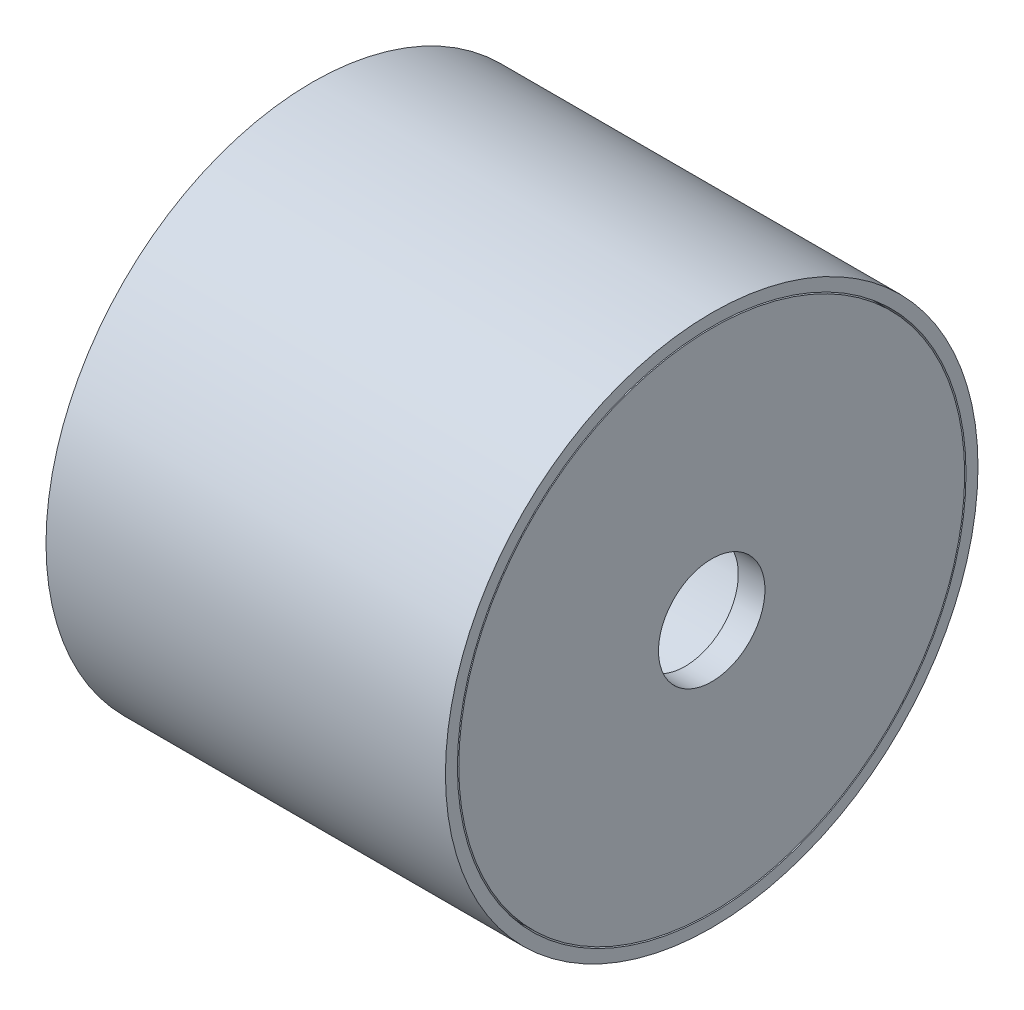
ISO-10303-21;
HEADER;
FILE_DESCRIPTION(('STEP AP214'),'2;1');
FILE_NAME('part.step','',(''),(''),'','','');
FILE_SCHEMA(('AUTOMOTIVE_DESIGN { 1 0 10303 214 1 1 1 1 }'));
ENDSEC;
DATA;
#1=APPLICATION_CONTEXT('core data for automotive mechanical design processes');
#2=APPLICATION_PROTOCOL_DEFINITION('international standard','automotive_design',2000,#1);
#3=PRODUCT_CONTEXT('',#1,'mechanical');
#4=PRODUCT('Part','Part','',(#3));
#5=PRODUCT_RELATED_PRODUCT_CATEGORY('part','',(#4));
#6=PRODUCT_DEFINITION_FORMATION('','',#4);
#7=PRODUCT_DEFINITION_CONTEXT('part definition',#1,'design');
#8=PRODUCT_DEFINITION('design','',#6,#7);
#9=PRODUCT_DEFINITION_SHAPE('','',#8);
#10=(LENGTH_UNIT() NAMED_UNIT(*) SI_UNIT(.MILLI.,.METRE.));
#11=(NAMED_UNIT(*) PLANE_ANGLE_UNIT() SI_UNIT($,.RADIAN.));
#12=(NAMED_UNIT(*) SI_UNIT($,.STERADIAN.) SOLID_ANGLE_UNIT());
#13=UNCERTAINTY_MEASURE_WITH_UNIT(LENGTH_MEASURE(1.E-05),#10,'distance_accuracy_value','');
#14=(GEOMETRIC_REPRESENTATION_CONTEXT(3) GLOBAL_UNCERTAINTY_ASSIGNED_CONTEXT((#13)) GLOBAL_UNIT_ASSIGNED_CONTEXT((#10,
#11,#12)) REPRESENTATION_CONTEXT('',''));
#15=CARTESIAN_POINT('',(0.,0.,0.));
#16=DIRECTION('',(0.,0.,1.));
#17=DIRECTION('',(1.,0.,0.));
#18=AXIS2_PLACEMENT_3D('',#15,#16,#17);
#19=CARTESIAN_POINT('',(15.,0.,0.));
#20=DIRECTION('',(1.,0.,0.));
#21=DIRECTION('',(0.,0.,1.));
#22=AXIS2_PLACEMENT_3D('',#19,#20,#21);
#23=CYLINDRICAL_SURFACE('',#22,10.);
#24=CARTESIAN_POINT('',(15.,0.,0.));
#25=DIRECTION('',(-1.,0.,0.));
#26=DIRECTION('',(0.,0.,1.));
#27=AXIS2_PLACEMENT_3D('',#24,#25,#26);
#28=CIRCLE('',#27,10.);
#29=CARTESIAN_POINT('',(15.,0.,10.));
#30=VERTEX_POINT('',#29);
#31=EDGE_CURVE('E11',#30,#30,#28,.T.);
#32=ORIENTED_EDGE('',*,*,#31,.T.);
#33=EDGE_LOOP('',(#32));
#34=FACE_BOUND('',#33,.T.);
#35=CARTESIAN_POINT('',(0.,0.,0.));
#36=DIRECTION('',(-1.,0.,0.));
#37=DIRECTION('',(0.,0.,1.));
#38=AXIS2_PLACEMENT_3D('',#35,#36,#37);
#39=CIRCLE('',#38,10.);
#40=CARTESIAN_POINT('',(0.,0.,10.));
#41=VERTEX_POINT('',#40);
#42=EDGE_CURVE('E109',#41,#41,#39,.T.);
#43=ORIENTED_EDGE('',*,*,#42,.F.);
#44=EDGE_LOOP('',(#43));
#45=FACE_BOUND('',#44,.T.);
#46=ADVANCED_FACE('F51',(#34,#45),#23,.T.);
#47=CARTESIAN_POINT('',(15.,9.55,0.));
#48=DIRECTION('',(1.,0.,0.));
#49=DIRECTION('',(0.,1.,0.));
#50=AXIS2_PLACEMENT_3D('',#47,#48,#49);
#51=PLANE('',#50);
#52=CARTESIAN_POINT('',(15.,0.,0.));
#53=DIRECTION('',(-1.,0.,0.));
#54=DIRECTION('',(0.,0.,1.));
#55=AXIS2_PLACEMENT_3D('',#52,#53,#54);
#56=CIRCLE('',#55,9.55);
#57=CARTESIAN_POINT('',(15.,0.,9.55));
#58=VERTEX_POINT('',#57);
#59=EDGE_CURVE('E59',#58,#58,#56,.T.);
#60=ORIENTED_EDGE('',*,*,#59,.T.);
#61=EDGE_LOOP('',(#60));
#62=FACE_BOUND('',#61,.T.);
#63=ORIENTED_EDGE('',*,*,#31,.F.);
#64=EDGE_LOOP('',(#63));
#65=FACE_BOUND('',#64,.T.);
#66=ADVANCED_FACE('F149',(#62,#65),#51,.T.);
#67=CARTESIAN_POINT('',(15.,0.,0.));
#68=DIRECTION('',(1.,0.,0.));
#69=DIRECTION('',(0.,0.,1.));
#70=AXIS2_PLACEMENT_3D('',#67,#68,#69);
#71=CYLINDRICAL_SURFACE('',#70,9.55);
#72=CARTESIAN_POINT('',(14.,0.,0.));
#73=DIRECTION('',(-1.,0.,0.));
#74=DIRECTION('',(0.,0.,1.));
#75=AXIS2_PLACEMENT_3D('',#72,#73,#74);
#76=CIRCLE('',#75,9.55);
#77=CARTESIAN_POINT('',(14.,0.,9.55));
#78=VERTEX_POINT('',#77);
#79=EDGE_CURVE('E95',#78,#78,#76,.T.);
#80=ORIENTED_EDGE('',*,*,#79,.T.);
#81=EDGE_LOOP('',(#80));
#82=FACE_BOUND('',#81,.T.);
#83=ORIENTED_EDGE('',*,*,#59,.F.);
#84=EDGE_LOOP('',(#83));
#85=FACE_BOUND('',#84,.T.);
#86=ADVANCED_FACE('F153',(#82,#85),#71,.F.);
#87=CARTESIAN_POINT('',(14.,9.5,0.));
#88=DIRECTION('',(1.,0.,0.));
#89=DIRECTION('',(0.,1.,0.));
#90=AXIS2_PLACEMENT_3D('',#87,#88,#89);
#91=PLANE('',#90);
#92=CARTESIAN_POINT('',(14.,0.,0.));
#93=DIRECTION('',(-1.,0.,0.));
#94=DIRECTION('',(0.,0.,1.));
#95=AXIS2_PLACEMENT_3D('',#92,#93,#94);
#96=CIRCLE('',#95,9.5);
#97=CARTESIAN_POINT('',(14.,0.,9.5));
#98=VERTEX_POINT('',#97);
#99=EDGE_CURVE('E90',#98,#98,#96,.T.);
#100=ORIENTED_EDGE('',*,*,#99,.T.);
#101=EDGE_LOOP('',(#100));
#102=FACE_BOUND('',#101,.T.);
#103=ORIENTED_EDGE('',*,*,#79,.F.);
#104=EDGE_LOOP('',(#103));
#105=FACE_BOUND('',#104,.T.);
#106=ADVANCED_FACE('F91',(#102,#105),#91,.T.);
#107=CARTESIAN_POINT('',(15.,0.,0.));
#108=DIRECTION('',(1.,0.,0.));
#109=DIRECTION('',(0.,0.,1.));
#110=AXIS2_PLACEMENT_3D('',#107,#108,#109);
#111=CYLINDRICAL_SURFACE('',#110,9.5);
#112=CARTESIAN_POINT('',(15.,0.,0.));
#113=DIRECTION('',(-1.,0.,0.));
#114=DIRECTION('',(0.,0.,1.));
#115=AXIS2_PLACEMENT_3D('',#112,#113,#114);
#116=CIRCLE('',#115,9.5);
#117=CARTESIAN_POINT('',(15.,0.,9.5));
#118=VERTEX_POINT('',#117);
#119=EDGE_CURVE('E96',#118,#118,#116,.T.);
#120=ORIENTED_EDGE('',*,*,#119,.T.);
#121=EDGE_LOOP('',(#120));
#122=FACE_BOUND('',#121,.T.);
#123=ORIENTED_EDGE('',*,*,#99,.F.);
#124=EDGE_LOOP('',(#123));
#125=FACE_BOUND('',#124,.T.);
#126=ADVANCED_FACE('F145',(#122,#125),#111,.T.);
#127=CARTESIAN_POINT('',(15.,2.,0.));
#128=DIRECTION('',(1.,0.,0.));
#129=DIRECTION('',(0.,1.,0.));
#130=AXIS2_PLACEMENT_3D('',#127,#128,#129);
#131=PLANE('',#130);
#132=CARTESIAN_POINT('',(15.,0.,0.));
#133=DIRECTION('',(-1.,0.,0.));
#134=DIRECTION('',(0.,0.,1.));
#135=AXIS2_PLACEMENT_3D('',#132,#133,#134);
#136=CIRCLE('',#135,2.);
#137=CARTESIAN_POINT('',(15.,0.,2.));
#138=VERTEX_POINT('',#137);
#139=EDGE_CURVE('E102',#138,#138,#136,.T.);
#140=ORIENTED_EDGE('',*,*,#139,.T.);
#141=EDGE_LOOP('',(#140));
#142=FACE_BOUND('',#141,.T.);
#143=ORIENTED_EDGE('',*,*,#119,.F.);
#144=EDGE_LOOP('',(#143));
#145=FACE_BOUND('',#144,.T.);
#146=ADVANCED_FACE('F129',(#142,#145),#131,.T.);
#147=CARTESIAN_POINT('',(15.,0.,0.));
#148=DIRECTION('',(1.,0.,0.));
#149=DIRECTION('',(0.,0.,1.));
#150=AXIS2_PLACEMENT_3D('',#147,#148,#149);
#151=CYLINDRICAL_SURFACE('',#150,2.);
#152=CARTESIAN_POINT('',(14.,0.,0.));
#153=DIRECTION('',(-1.,0.,0.));
#154=DIRECTION('',(0.,0.,1.));
#155=AXIS2_PLACEMENT_3D('',#152,#153,#154);
#156=CIRCLE('',#155,2.);
#157=CARTESIAN_POINT('',(14.,0.,2.));
#158=VERTEX_POINT('',#157);
#159=EDGE_CURVE('E114',#158,#158,#156,.T.);
#160=ORIENTED_EDGE('',*,*,#159,.T.);
#161=EDGE_LOOP('',(#160));
#162=FACE_BOUND('',#161,.T.);
#163=ORIENTED_EDGE('',*,*,#139,.F.);
#164=EDGE_LOOP('',(#163));
#165=FACE_BOUND('',#164,.T.);
#166=ADVANCED_FACE('F133',(#162,#165),#151,.F.);
#167=CARTESIAN_POINT('',(14.,4.,0.));
#168=DIRECTION('',(-1.,0.,0.));
#169=DIRECTION('',(0.,0.,-1.));
#170=AXIS2_PLACEMENT_3D('',#167,#168,#169);
#171=PLANE('',#170);
#172=CARTESIAN_POINT('',(14.,0.,0.));
#173=DIRECTION('',(-1.,0.,0.));
#174=DIRECTION('',(0.,0.,1.));
#175=AXIS2_PLACEMENT_3D('',#172,#173,#174);
#176=CIRCLE('',#175,4.);
#177=CARTESIAN_POINT('',(14.,0.,4.));
#178=VERTEX_POINT('',#177);
#179=EDGE_CURVE('E110',#178,#178,#176,.T.);
#180=ORIENTED_EDGE('',*,*,#179,.T.);
#181=EDGE_LOOP('',(#180));
#182=FACE_BOUND('',#181,.T.);
#183=ORIENTED_EDGE('',*,*,#159,.F.);
#184=EDGE_LOOP('',(#183));
#185=FACE_BOUND('',#184,.T.);
#186=ADVANCED_FACE('F135',(#182,#185),#171,.T.);
#187=CARTESIAN_POINT('',(15.,0.,0.));
#188=DIRECTION('',(1.,0.,0.));
#189=DIRECTION('',(0.,0.,1.));
#190=AXIS2_PLACEMENT_3D('',#187,#188,#189);
#191=CYLINDRICAL_SURFACE('',#190,4.);
#192=CARTESIAN_POINT('',(0.,0.,0.));
#193=DIRECTION('',(-1.,0.,0.));
#194=DIRECTION('',(0.,0.,1.));
#195=AXIS2_PLACEMENT_3D('',#192,#193,#194);
#196=CIRCLE('',#195,4.);
#197=CARTESIAN_POINT('',(0.,0.,4.));
#198=VERTEX_POINT('',#197);
#199=EDGE_CURVE('E105',#198,#198,#196,.T.);
#200=ORIENTED_EDGE('',*,*,#199,.T.);
#201=EDGE_LOOP('',(#200));
#202=FACE_BOUND('',#201,.T.);
#203=ORIENTED_EDGE('',*,*,#179,.F.);
#204=EDGE_LOOP('',(#203));
#205=FACE_BOUND('',#204,.T.);
#206=ADVANCED_FACE('F142',(#202,#205),#191,.F.);
#207=CARTESIAN_POINT('',(0.,10.,0.));
#208=DIRECTION('',(-1.,0.,0.));
#209=DIRECTION('',(0.,0.,-1.));
#210=AXIS2_PLACEMENT_3D('',#207,#208,#209);
#211=PLANE('',#210);
#212=ORIENTED_EDGE('',*,*,#42,.T.);
#213=EDGE_LOOP('',(#212));
#214=FACE_BOUND('',#213,.T.);
#215=ORIENTED_EDGE('',*,*,#199,.F.);
#216=EDGE_LOOP('',(#215));
#217=FACE_BOUND('',#216,.T.);
#218=ADVANCED_FACE('F162',(#214,#217),#211,.T.);
#219=CLOSED_SHELL('',(#46,#66,#86,#106,#126,#146,#166,#186,#206,#218));
#220=MANIFOLD_SOLID_BREP('B2',#219);
#221=ADVANCED_BREP_SHAPE_REPRESENTATION('',(#18,#220),#14);
#222=SHAPE_DEFINITION_REPRESENTATION(#9,#221);
ENDSEC;
END-ISO-10303-21;
